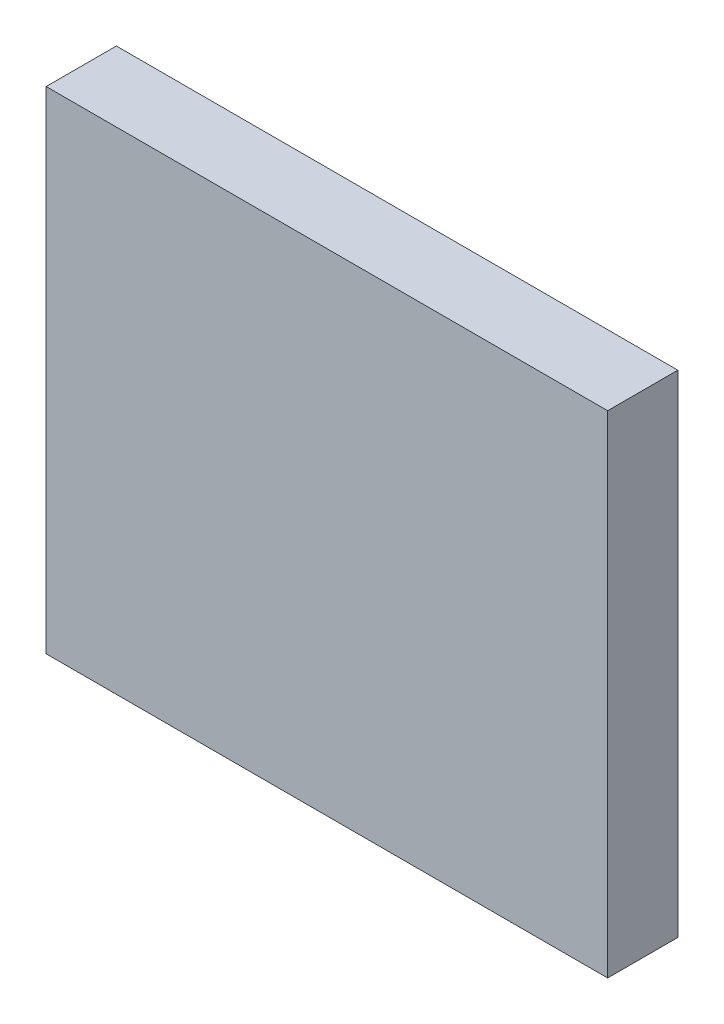
ISO-10303-21;
HEADER;
FILE_DESCRIPTION(('STEP AP214'),'2;1');
FILE_NAME('part.step','',(''),(''),'','','');
FILE_SCHEMA(('AUTOMOTIVE_DESIGN { 1 0 10303 214 1 1 1 1 }'));
ENDSEC;
DATA;
#1=APPLICATION_CONTEXT('core data for automotive mechanical design processes');
#2=APPLICATION_PROTOCOL_DEFINITION('international standard','automotive_design',2000,#1);
#3=PRODUCT_CONTEXT('',#1,'mechanical');
#4=PRODUCT('Part','Part','',(#3));
#5=PRODUCT_RELATED_PRODUCT_CATEGORY('part','',(#4));
#6=PRODUCT_DEFINITION_FORMATION('','',#4);
#7=PRODUCT_DEFINITION_CONTEXT('part definition',#1,'design');
#8=PRODUCT_DEFINITION('design','',#6,#7);
#9=PRODUCT_DEFINITION_SHAPE('','',#8);
#10=(LENGTH_UNIT() NAMED_UNIT(*) SI_UNIT(.MILLI.,.METRE.));
#11=(NAMED_UNIT(*) PLANE_ANGLE_UNIT() SI_UNIT($,.RADIAN.));
#12=(NAMED_UNIT(*) SI_UNIT($,.STERADIAN.) SOLID_ANGLE_UNIT());
#13=UNCERTAINTY_MEASURE_WITH_UNIT(LENGTH_MEASURE(1.E-05),#10,'distance_accuracy_value','');
#14=(GEOMETRIC_REPRESENTATION_CONTEXT(3) GLOBAL_UNCERTAINTY_ASSIGNED_CONTEXT((#13)) GLOBAL_UNIT_ASSIGNED_CONTEXT((#10,
#11,#12)) REPRESENTATION_CONTEXT('',''));
#15=CARTESIAN_POINT('',(0.,0.,0.));
#16=DIRECTION('',(0.,0.,1.));
#17=DIRECTION('',(1.,0.,0.));
#18=AXIS2_PLACEMENT_3D('',#15,#16,#17);
#19=CARTESIAN_POINT('',(-40.,-35.,10.));
#20=DIRECTION('',(-1.,0.,0.));
#21=DIRECTION('',(0.,0.,1.));
#22=AXIS2_PLACEMENT_3D('',#19,#20,#21);
#23=PLANE('',#22);
#24=DIRECTION('',(0.,1.,0.));
#25=VECTOR('',#24,1.);
#26=CARTESIAN_POINT('',(-40.,-35.,0.));
#27=LINE('',#26,#25);
#28=CARTESIAN_POINT('',(-40.,-35.,0.));
#29=VERTEX_POINT('',#28);
#30=CARTESIAN_POINT('',(-40.,35.,0.));
#31=VERTEX_POINT('',#30);
#32=EDGE_CURVE('E97',#29,#31,#27,.T.);
#33=ORIENTED_EDGE('',*,*,#32,.F.);
#34=DIRECTION('',(0.,0.,-1.));
#35=VECTOR('',#34,1.);
#36=CARTESIAN_POINT('',(-40.,-35.,10.));
#37=LINE('',#36,#35);
#38=CARTESIAN_POINT('',(-40.,-35.,10.));
#39=VERTEX_POINT('',#38);
#40=EDGE_CURVE('E11',#39,#29,#37,.T.);
#41=ORIENTED_EDGE('',*,*,#40,.F.);
#42=DIRECTION('',(0.,1.,0.));
#43=VECTOR('',#42,1.);
#44=CARTESIAN_POINT('',(-40.,-35.,10.));
#45=LINE('',#44,#43);
#46=CARTESIAN_POINT('',(-40.,35.,10.));
#47=VERTEX_POINT('',#46);
#48=EDGE_CURVE('E92',#39,#47,#45,.T.);
#49=ORIENTED_EDGE('',*,*,#48,.T.);
#50=DIRECTION('',(0.,0.,-1.));
#51=VECTOR('',#50,1.);
#52=CARTESIAN_POINT('',(-40.,35.,10.));
#53=LINE('',#52,#51);
#54=EDGE_CURVE('E35',#47,#31,#53,.T.);
#55=ORIENTED_EDGE('',*,*,#54,.T.);
#56=EDGE_LOOP('',(#33,#41,#49,#55));
#57=FACE_BOUND('',#56,.T.);
#58=ADVANCED_FACE('F32',(#57),#23,.T.);
#59=CARTESIAN_POINT('',(-40.,-35.,10.));
#60=DIRECTION('',(0.,1.,0.));
#61=DIRECTION('',(0.,0.,1.));
#62=AXIS2_PLACEMENT_3D('',#59,#60,#61);
#63=PLANE('',#62);
#64=DIRECTION('',(1.,0.,0.));
#65=VECTOR('',#64,1.);
#66=CARTESIAN_POINT('',(-40.,-35.,0.));
#67=LINE('',#66,#65);
#68=CARTESIAN_POINT('',(40.,-35.,0.));
#69=VERTEX_POINT('',#68);
#70=EDGE_CURVE('E65',#29,#69,#67,.T.);
#71=ORIENTED_EDGE('',*,*,#70,.T.);
#72=DIRECTION('',(0.,0.,-1.));
#73=VECTOR('',#72,1.);
#74=CARTESIAN_POINT('',(40.,-35.,10.));
#75=LINE('',#74,#73);
#76=CARTESIAN_POINT('',(40.,-35.,10.));
#77=VERTEX_POINT('',#76);
#78=EDGE_CURVE('E41',#77,#69,#75,.T.);
#79=ORIENTED_EDGE('',*,*,#78,.F.);
#80=DIRECTION('',(1.,0.,0.));
#81=VECTOR('',#80,1.);
#82=CARTESIAN_POINT('',(-40.,-35.,10.));
#83=LINE('',#82,#81);
#84=EDGE_CURVE('E82',#39,#77,#83,.T.);
#85=ORIENTED_EDGE('',*,*,#84,.F.);
#86=ORIENTED_EDGE('',*,*,#40,.T.);
#87=EDGE_LOOP('',(#71,#79,#85,#86));
#88=FACE_BOUND('',#87,.T.);
#89=ADVANCED_FACE('F107',(#88),#63,.F.);
#90=CARTESIAN_POINT('',(40.,-35.,10.));
#91=DIRECTION('',(-1.,0.,0.));
#92=DIRECTION('',(0.,0.,1.));
#93=AXIS2_PLACEMENT_3D('',#90,#91,#92);
#94=PLANE('',#93);
#95=DIRECTION('',(0.,1.,0.));
#96=VECTOR('',#95,1.);
#97=CARTESIAN_POINT('',(40.,-35.,0.));
#98=LINE('',#97,#96);
#99=CARTESIAN_POINT('',(40.,35.,0.));
#100=VERTEX_POINT('',#99);
#101=EDGE_CURVE('E89',#69,#100,#98,.T.);
#102=ORIENTED_EDGE('',*,*,#101,.T.);
#103=DIRECTION('',(0.,0.,-1.));
#104=VECTOR('',#103,1.);
#105=CARTESIAN_POINT('',(40.,35.,10.));
#106=LINE('',#105,#104);
#107=CARTESIAN_POINT('',(40.,35.,10.));
#108=VERTEX_POINT('',#107);
#109=EDGE_CURVE('E86',#108,#100,#106,.T.);
#110=ORIENTED_EDGE('',*,*,#109,.F.);
#111=DIRECTION('',(0.,1.,0.));
#112=VECTOR('',#111,1.);
#113=CARTESIAN_POINT('',(40.,-35.,10.));
#114=LINE('',#113,#112);
#115=EDGE_CURVE('E77',#77,#108,#114,.T.);
#116=ORIENTED_EDGE('',*,*,#115,.F.);
#117=ORIENTED_EDGE('',*,*,#78,.T.);
#118=EDGE_LOOP('',(#102,#110,#116,#117));
#119=FACE_BOUND('',#118,.T.);
#120=ADVANCED_FACE('F87',(#119),#94,.F.);
#121=CARTESIAN_POINT('',(-40.,35.,10.));
#122=DIRECTION('',(0.,1.,0.));
#123=DIRECTION('',(0.,0.,1.));
#124=AXIS2_PLACEMENT_3D('',#121,#122,#123);
#125=PLANE('',#124);
#126=DIRECTION('',(1.,0.,0.));
#127=VECTOR('',#126,1.);
#128=CARTESIAN_POINT('',(-40.,35.,0.));
#129=LINE('',#128,#127);
#130=EDGE_CURVE('E100',#31,#100,#129,.T.);
#131=ORIENTED_EDGE('',*,*,#130,.F.);
#132=ORIENTED_EDGE('',*,*,#54,.F.);
#133=DIRECTION('',(1.,0.,0.));
#134=VECTOR('',#133,1.);
#135=CARTESIAN_POINT('',(-40.,35.,10.));
#136=LINE('',#135,#134);
#137=EDGE_CURVE('E81',#47,#108,#136,.T.);
#138=ORIENTED_EDGE('',*,*,#137,.T.);
#139=ORIENTED_EDGE('',*,*,#109,.T.);
#140=EDGE_LOOP('',(#131,#132,#138,#139));
#141=FACE_BOUND('',#140,.T.);
#142=ADVANCED_FACE('F91',(#141),#125,.T.);
#143=CARTESIAN_POINT('',(0.,0.,10.));
#144=DIRECTION('',(0.,0.,-1.));
#145=DIRECTION('',(-1.,0.,0.));
#146=AXIS2_PLACEMENT_3D('',#143,#144,#145);
#147=PLANE('',#146);
#148=ORIENTED_EDGE('',*,*,#48,.F.);
#149=ORIENTED_EDGE('',*,*,#84,.T.);
#150=ORIENTED_EDGE('',*,*,#115,.T.);
#151=ORIENTED_EDGE('',*,*,#137,.F.);
#152=EDGE_LOOP('',(#148,#149,#150,#151));
#153=FACE_BOUND('',#152,.T.);
#154=ADVANCED_FACE('F80',(#153),#147,.F.);
#155=CARTESIAN_POINT('',(0.,0.,0.));
#156=DIRECTION('',(0.,0.,-1.));
#157=DIRECTION('',(-1.,0.,0.));
#158=AXIS2_PLACEMENT_3D('',#155,#156,#157);
#159=PLANE('',#158);
#160=ORIENTED_EDGE('',*,*,#32,.T.);
#161=ORIENTED_EDGE('',*,*,#130,.T.);
#162=ORIENTED_EDGE('',*,*,#101,.F.);
#163=ORIENTED_EDGE('',*,*,#70,.F.);
#164=EDGE_LOOP('',(#160,#161,#162,#163));
#165=FACE_BOUND('',#164,.T.);
#166=ADVANCED_FACE('F105',(#165),#159,.T.);
#167=CLOSED_SHELL('',(#58,#89,#120,#142,#154,#166));
#168=MANIFOLD_SOLID_BREP('B2',#167);
#169=ADVANCED_BREP_SHAPE_REPRESENTATION('',(#18,#168),#14);
#170=SHAPE_DEFINITION_REPRESENTATION(#9,#169);
ENDSEC;
END-ISO-10303-21;
